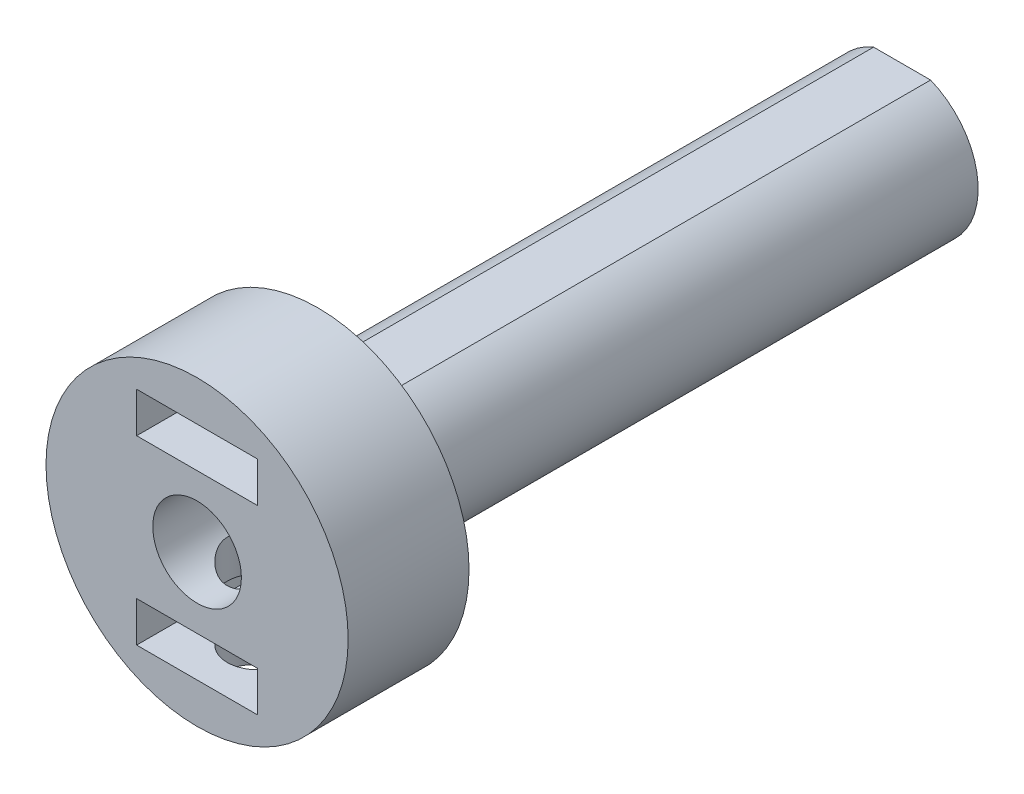
ISO-10303-21;
HEADER;
FILE_DESCRIPTION(('STEP AP214'),'2;1');
FILE_NAME('part.step','',(''),(''),'','','');
FILE_SCHEMA(('AUTOMOTIVE_DESIGN { 1 0 10303 214 1 1 1 1 }'));
ENDSEC;
DATA;
#1=APPLICATION_CONTEXT('core data for automotive mechanical design processes');
#2=APPLICATION_PROTOCOL_DEFINITION('international standard','automotive_design',2000,#1);
#3=PRODUCT_CONTEXT('',#1,'mechanical');
#4=PRODUCT('Part','Part','',(#3));
#5=PRODUCT_RELATED_PRODUCT_CATEGORY('part','',(#4));
#6=PRODUCT_DEFINITION_FORMATION('','',#4);
#7=PRODUCT_DEFINITION_CONTEXT('part definition',#1,'design');
#8=PRODUCT_DEFINITION('design','',#6,#7);
#9=PRODUCT_DEFINITION_SHAPE('','',#8);
#10=(LENGTH_UNIT() NAMED_UNIT(*) SI_UNIT(.MILLI.,.METRE.));
#11=(NAMED_UNIT(*) PLANE_ANGLE_UNIT() SI_UNIT($,.RADIAN.));
#12=(NAMED_UNIT(*) SI_UNIT($,.STERADIAN.) SOLID_ANGLE_UNIT());
#13=UNCERTAINTY_MEASURE_WITH_UNIT(LENGTH_MEASURE(1.E-05),#10,'distance_accuracy_value','');
#14=(GEOMETRIC_REPRESENTATION_CONTEXT(3) GLOBAL_UNCERTAINTY_ASSIGNED_CONTEXT((#13)) GLOBAL_UNIT_ASSIGNED_CONTEXT((#10,
#11,#12)) REPRESENTATION_CONTEXT('',''));
#15=CARTESIAN_POINT('',(0.,0.,0.));
#16=DIRECTION('',(0.,0.,1.));
#17=DIRECTION('',(1.,0.,0.));
#18=AXIS2_PLACEMENT_3D('',#15,#16,#17);
#19=CARTESIAN_POINT('',(0.,0.,35.));
#20=DIRECTION('',(0.,0.,-1.));
#21=DIRECTION('',(-1.,0.,0.));
#22=AXIS2_PLACEMENT_3D('',#19,#20,#21);
#23=CYLINDRICAL_SURFACE('',#22,3.775);
#24=CARTESIAN_POINT('',(0.,0.,29.));
#25=DIRECTION('',(0.,0.,1.));
#26=DIRECTION('',(1.,0.,0.));
#27=AXIS2_PLACEMENT_3D('',#24,#25,#26);
#28=CIRCLE('',#27,3.775);
#29=CARTESIAN_POINT('',(-1.41443451598156,3.5,29.));
#30=VERTEX_POINT('',#29);
#31=CARTESIAN_POINT('',(-1.41443451598156,-3.5,29.));
#32=VERTEX_POINT('',#31);
#33=EDGE_CURVE('E214',#30,#32,#28,.T.);
#34=ORIENTED_EDGE('',*,*,#33,.F.);
#35=DIRECTION('',(0.,0.,-1.));
#36=VECTOR('',#35,1.);
#37=CARTESIAN_POINT('',(-1.41443451598156,3.5,35.));
#38=LINE('',#37,#36);
#39=CARTESIAN_POINT('',(-1.41443451598156,3.5,0.));
#40=VERTEX_POINT('',#39);
#41=EDGE_CURVE('E192',#30,#40,#38,.T.);
#42=ORIENTED_EDGE('',*,*,#41,.T.);
#43=CARTESIAN_POINT('',(0.,0.,0.));
#44=DIRECTION('',(0.,0.,1.));
#45=DIRECTION('',(1.,0.,0.));
#46=AXIS2_PLACEMENT_3D('',#43,#44,#45);
#47=CIRCLE('',#46,3.775);
#48=CARTESIAN_POINT('',(-1.41443451598156,-3.5,0.));
#49=VERTEX_POINT('',#48);
#50=EDGE_CURVE('E210',#40,#49,#47,.T.);
#51=ORIENTED_EDGE('',*,*,#50,.T.);
#52=DIRECTION('',(0.,0.,-1.));
#53=VECTOR('',#52,1.);
#54=CARTESIAN_POINT('',(-1.41443451598156,-3.5,35.));
#55=LINE('',#54,#53);
#56=EDGE_CURVE('E159',#49,#32,#55,.F.);
#57=ORIENTED_EDGE('',*,*,#56,.T.);
#58=EDGE_LOOP('',(#34,#42,#51,#57));
#59=FACE_BOUND('',#58,.T.);
#60=ADVANCED_FACE('F35',(#59),#23,.T.);
#61=CARTESIAN_POINT('',(1.41443451598156,-3.5,0.));
#62=VERTEX_POINT('',#61);
#63=CARTESIAN_POINT('',(1.41443451598156,3.5,0.));
#64=VERTEX_POINT('',#63);
#65=EDGE_CURVE('E205',#62,#64,#47,.T.);
#66=ORIENTED_EDGE('',*,*,#65,.T.);
#67=DIRECTION('',(0.,0.,-1.));
#68=VECTOR('',#67,1.);
#69=CARTESIAN_POINT('',(1.41443451598156,3.5,35.));
#70=LINE('',#69,#68);
#71=CARTESIAN_POINT('',(1.41443451598156,3.5,29.));
#72=VERTEX_POINT('',#71);
#73=EDGE_CURVE('E189',#64,#72,#70,.F.);
#74=ORIENTED_EDGE('',*,*,#73,.T.);
#75=CARTESIAN_POINT('',(1.41443451598156,-3.5,29.));
#76=VERTEX_POINT('',#75);
#77=EDGE_CURVE('E211',#76,#72,#28,.T.);
#78=ORIENTED_EDGE('',*,*,#77,.F.);
#79=DIRECTION('',(0.,0.,-1.));
#80=VECTOR('',#79,1.);
#81=CARTESIAN_POINT('',(1.41443451598156,-3.5,35.));
#82=LINE('',#81,#80);
#83=EDGE_CURVE('E186',#76,#62,#82,.T.);
#84=ORIENTED_EDGE('',*,*,#83,.T.);
#85=EDGE_LOOP('',(#66,#74,#78,#84));
#86=FACE_BOUND('',#85,.T.);
#87=ADVANCED_FACE('F37',(#86),#23,.T.);
#88=CARTESIAN_POINT('',(0.,0.,35.));
#89=DIRECTION('',(0.,0.,1.));
#90=DIRECTION('',(1.,0.,0.));
#91=AXIS2_PLACEMENT_3D('',#88,#89,#90);
#92=PLANE('',#91);
#93=DIRECTION('',(0.,1.,0.));
#94=VECTOR('',#93,1.);
#95=CARTESIAN_POINT('',(3.,5.5,35.));
#96=LINE('',#95,#94);
#97=CARTESIAN_POINT('',(3.,3.5,35.));
#98=VERTEX_POINT('',#97);
#99=CARTESIAN_POINT('',(3.,5.5,35.));
#100=VERTEX_POINT('',#99);
#101=EDGE_CURVE('E53',#98,#100,#96,.T.);
#102=ORIENTED_EDGE('',*,*,#101,.F.);
#103=DIRECTION('',(1.,0.,0.));
#104=VECTOR('',#103,1.);
#105=CARTESIAN_POINT('',(-3.,3.5,35.));
#106=LINE('',#105,#104);
#107=CARTESIAN_POINT('',(-3.,3.5,35.));
#108=VERTEX_POINT('',#107);
#109=EDGE_CURVE('E151',#108,#98,#106,.T.);
#110=ORIENTED_EDGE('',*,*,#109,.F.);
#111=DIRECTION('',(0.,-1.,0.));
#112=VECTOR('',#111,1.);
#113=CARTESIAN_POINT('',(-3.,5.5,35.));
#114=LINE('',#113,#112);
#115=CARTESIAN_POINT('',(-3.,5.5,35.));
#116=VERTEX_POINT('',#115);
#117=EDGE_CURVE('E134',#116,#108,#114,.T.);
#118=ORIENTED_EDGE('',*,*,#117,.F.);
#119=DIRECTION('',(-1.,0.,0.));
#120=VECTOR('',#119,1.);
#121=CARTESIAN_POINT('',(-3.,5.5,35.));
#122=LINE('',#121,#120);
#123=EDGE_CURVE('E144',#100,#116,#122,.T.);
#124=ORIENTED_EDGE('',*,*,#123,.F.);
#125=EDGE_LOOP('',(#102,#110,#118,#124));
#126=FACE_BOUND('',#125,.T.);
#127=DIRECTION('',(0.,-1.,0.));
#128=VECTOR('',#127,1.);
#129=CARTESIAN_POINT('',(-3.,-5.5,35.));
#130=LINE('',#129,#128);
#131=CARTESIAN_POINT('',(-3.,-3.5,35.));
#132=VERTEX_POINT('',#131);
#133=CARTESIAN_POINT('',(-3.,-5.5,35.));
#134=VERTEX_POINT('',#133);
#135=EDGE_CURVE('E61',#132,#134,#130,.T.);
#136=ORIENTED_EDGE('',*,*,#135,.F.);
#137=DIRECTION('',(-1.,0.,0.));
#138=VECTOR('',#137,1.);
#139=CARTESIAN_POINT('',(-3.,-3.5,35.));
#140=LINE('',#139,#138);
#141=CARTESIAN_POINT('',(3.,-3.5,35.));
#142=VERTEX_POINT('',#141);
#143=EDGE_CURVE('E166',#142,#132,#140,.T.);
#144=ORIENTED_EDGE('',*,*,#143,.F.);
#145=DIRECTION('',(0.,1.,0.));
#146=VECTOR('',#145,1.);
#147=CARTESIAN_POINT('',(3.,-5.5,35.));
#148=LINE('',#147,#146);
#149=CARTESIAN_POINT('',(3.,-5.5,35.));
#150=VERTEX_POINT('',#149);
#151=EDGE_CURVE('E172',#150,#142,#148,.T.);
#152=ORIENTED_EDGE('',*,*,#151,.F.);
#153=DIRECTION('',(1.,0.,0.));
#154=VECTOR('',#153,1.);
#155=CARTESIAN_POINT('',(-3.,-5.5,35.));
#156=LINE('',#155,#154);
#157=EDGE_CURVE('E168',#134,#150,#156,.T.);
#158=ORIENTED_EDGE('',*,*,#157,.F.);
#159=EDGE_LOOP('',(#136,#144,#152,#158));
#160=FACE_BOUND('',#159,.T.);
#161=CARTESIAN_POINT('',(0.,0.,35.));
#162=DIRECTION('',(0.,0.,1.));
#163=DIRECTION('',(1.,0.,0.));
#164=AXIS2_PLACEMENT_3D('',#161,#162,#163);
#165=CIRCLE('',#164,2.2);
#166=CARTESIAN_POINT('',(2.2,0.,35.));
#167=VERTEX_POINT('',#166);
#168=EDGE_CURVE('E202',#167,#167,#165,.T.);
#169=ORIENTED_EDGE('',*,*,#168,.F.);
#170=EDGE_LOOP('',(#169));
#171=FACE_BOUND('',#170,.T.);
#172=CARTESIAN_POINT('',(0.,0.,35.));
#173=DIRECTION('',(0.,0.,1.));
#174=DIRECTION('',(1.,0.,0.));
#175=AXIS2_PLACEMENT_3D('',#172,#173,#174);
#176=CIRCLE('',#175,7.5);
#177=CARTESIAN_POINT('',(7.5,0.,35.));
#178=VERTEX_POINT('',#177);
#179=EDGE_CURVE('E195',#178,#178,#176,.T.);
#180=ORIENTED_EDGE('',*,*,#179,.T.);
#181=EDGE_LOOP('',(#180));
#182=FACE_BOUND('',#181,.T.);
#183=ADVANCED_FACE('F148',(#126,#160,#171,#182),#92,.T.);
#184=CARTESIAN_POINT('',(0.,0.,0.));
#185=DIRECTION('',(0.,0.,1.));
#186=DIRECTION('',(1.,0.,0.));
#187=AXIS2_PLACEMENT_3D('',#184,#185,#186);
#188=PLANE('',#187);
#189=ORIENTED_EDGE('',*,*,#50,.F.);
#190=DIRECTION('',(1.,0.,0.));
#191=VECTOR('',#190,1.);
#192=CARTESIAN_POINT('',(-3.,3.5,0.));
#193=LINE('',#192,#191);
#194=EDGE_CURVE('E153',#40,#64,#193,.T.);
#195=ORIENTED_EDGE('',*,*,#194,.T.);
#196=ORIENTED_EDGE('',*,*,#65,.F.);
#197=DIRECTION('',(-1.,0.,0.));
#198=VECTOR('',#197,1.);
#199=CARTESIAN_POINT('',(-3.,-3.5,0.));
#200=LINE('',#199,#198);
#201=EDGE_CURVE('E162',#62,#49,#200,.T.);
#202=ORIENTED_EDGE('',*,*,#201,.T.);
#203=EDGE_LOOP('',(#189,#195,#196,#202));
#204=FACE_BOUND('',#203,.T.);
#205=CARTESIAN_POINT('',(0.,0.,0.));
#206=DIRECTION('',(0.,0.,1.));
#207=DIRECTION('',(1.,0.,0.));
#208=AXIS2_PLACEMENT_3D('',#205,#206,#207);
#209=CIRCLE('',#208,2.2);
#210=CARTESIAN_POINT('',(2.2,0.,0.));
#211=VERTEX_POINT('',#210);
#212=EDGE_CURVE('E199',#211,#211,#209,.T.);
#213=ORIENTED_EDGE('',*,*,#212,.T.);
#214=EDGE_LOOP('',(#213));
#215=FACE_BOUND('',#214,.T.);
#216=ADVANCED_FACE('F296',(#204,#215),#188,.F.);
#217=CARTESIAN_POINT('',(0.,0.,35.));
#218=DIRECTION('',(0.,0.,-1.));
#219=DIRECTION('',(-1.,0.,0.));
#220=AXIS2_PLACEMENT_3D('',#217,#218,#219);
#221=CYLINDRICAL_SURFACE('',#220,2.2);
#222=CARTESIAN_POINT('',(0.,-2.2,33.5));
#223=CARTESIAN_POINT('',(0.0749947236800003,-2.19999876587917,33.4999987617111));
#224=CARTESIAN_POINT('',(0.15000139660477,-2.19613136834137,33.4943431739115));
#225=CARTESIAN_POINT('',(0.297618614641615,-2.18104081694112,33.4720749248396));
#226=CARTESIAN_POINT('',(0.370227583527062,-2.16981292164153,33.4554552007182));
#227=CARTESIAN_POINT('',(0.510678960454555,-2.14110388606965,33.4122971835474));
#228=CARTESIAN_POINT('',(0.578542693049043,-2.12365320456865,33.3858071748667));
#229=CARTESIAN_POINT('',(0.708561327092108,-2.08388327690579,33.3240568886633));
#230=CARTESIAN_POINT('',(0.770715554218414,-2.06156345672123,33.288795577023));
#231=CARTESIAN_POINT('',(0.893630248020961,-2.01151685190503,33.207199416211));
#232=CARTESIAN_POINT('',(0.953804851810724,-1.9834893356327,33.160170438007));
#233=CARTESIAN_POINT('',(1.06595851734569,-1.92554583420865,33.0580621817867));
#234=CARTESIAN_POINT('',(1.11792533396173,-1.89562711898162,33.0029711075305));
#235=CARTESIAN_POINT('',(1.22102587999676,-1.83122019787791,32.8757166926345));
#236=CARTESIAN_POINT('',(1.27058837485202,-1.79679817680349,32.8022375091627));
#237=CARTESIAN_POINT('',(1.35663972827704,-1.7327446393426,32.6460969089472));
#238=CARTESIAN_POINT('',(1.39315102225501,-1.70310495058715,32.5634515727747));
#239=CARTESIAN_POINT('',(1.44253226686971,-1.66127060522603,32.4161658176695));
#240=CARTESIAN_POINT('',(1.45920727089758,-1.64650977162852,32.3535381580968));
#241=CARTESIAN_POINT('',(1.48438184282993,-1.62385459721723,32.2254982668008));
#242=CARTESIAN_POINT('',(1.4928962582051,-1.61594778862538,32.1600913191385));
#243=CARTESIAN_POINT('',(1.50120728205233,-1.60823335448382,32.0279088174044));
#244=CARTESIAN_POINT('',(1.50096198300143,-1.60846466258124,31.9611282123032));
#245=CARTESIAN_POINT('',(1.49166706200119,-1.61708511867639,31.8287018371389));
#246=CARTESIAN_POINT('',(1.48261107737561,-1.62548016215027,31.7630569220892));
#247=CARTESIAN_POINT('',(1.45703685261497,-1.64842759253135,31.6382099407675));
#248=CARTESIAN_POINT('',(1.44094473579542,-1.6626257193026,31.5788511421179));
#249=CARTESIAN_POINT('',(1.40214876841322,-1.69547185796776,31.4636420250226));
#250=CARTESIAN_POINT('',(1.3794397815828,-1.7141233246761,31.4077944732402));
#251=CARTESIAN_POINT('',(1.31533186152764,-1.76416012841628,31.2734655193162));
#252=CARTESIAN_POINT('',(1.27023693131449,-1.79729195535348,31.1973883511484));
#253=CARTESIAN_POINT('',(1.16794328619874,-1.86539520998826,31.0546765023726));
#254=CARTESIAN_POINT('',(1.11072188458761,-1.90036999210653,30.9880599166973));
#255=CARTESIAN_POINT('',(0.984419198169491,-1.9687880960807,30.8647595249156));
#256=CARTESIAN_POINT('',(0.915236676014048,-2.00221497447541,30.8081696197384));
#257=CARTESIAN_POINT('',(0.766347654237348,-2.06377497290833,30.7074241601516));
#258=CARTESIAN_POINT('',(0.686663415612508,-2.09191899358059,30.6632429061034));
#259=CARTESIAN_POINT('',(0.537146765353034,-2.13450495966265,30.5976511402708));
#260=CARTESIAN_POINT('',(0.469046173547685,-2.15060132357203,30.5733639754874));
#261=CARTESIAN_POINT('',(0.328924761012331,-2.17643489148159,30.5347089157273));
#262=CARTESIAN_POINT('',(0.256906622565166,-2.18617638863629,30.5203343237426));
#263=CARTESIAN_POINT('',(0.11066637814047,-2.19844333665874,30.5022691391091));
#264=CARTESIAN_POINT('',(0.0364375831026466,-2.20094402089915,30.4986152150914));
#265=CARTESIAN_POINT('',(-0.111616465790141,-2.19841367489988,30.5023269102472));
#266=CARTESIAN_POINT('',(-0.185441702494,-2.19338232701081,30.509692994169));
#267=CARTESIAN_POINT('',(-0.32644023174148,-2.17674255802001,30.5342975333502));
#268=CARTESIAN_POINT('',(-0.393757191845172,-2.16550537266208,30.5509793000107));
#269=CARTESIAN_POINT('',(-0.524430369312651,-2.13762506973865,30.5929864557801));
#270=CARTESIAN_POINT('',(-0.587785856491799,-2.12098095904274,30.6183134328629));
#271=CARTESIAN_POINT('',(-0.714318580611975,-2.0819406503214,30.6789928291518));
#272=CARTESIAN_POINT('',(-0.777078128415484,-2.05919142172993,30.7149840038628));
#273=CARTESIAN_POINT('',(-0.895935950895949,-2.01033237123317,30.7948304807018));
#274=CARTESIAN_POINT('',(-0.952029169501493,-1.98422002946111,30.8386916893675));
#275=CARTESIAN_POINT('',(-1.06587589663891,-1.92578711915662,30.941353046364));
#276=CARTESIAN_POINT('',(-1.12232665214487,-1.89316034049541,31.0014249799554));
#277=CARTESIAN_POINT('',(-1.22484571380228,-1.82850351902241,31.130211595121));
#278=CARTESIAN_POINT('',(-1.27090915111398,-1.79647376247814,31.1989303062783));
#279=CARTESIAN_POINT('',(-1.34620460549643,-1.7405817419621,31.3344940671726));
#280=CARTESIAN_POINT('',(-1.37687372493794,-1.71620112372699,31.4003228410442));
#281=CARTESIAN_POINT('',(-1.42874491666754,-1.67326845445794,31.5373664129934));
#282=CARTESIAN_POINT('',(-1.44996560369061,-1.65470496444313,31.608570294579));
#283=CARTESIAN_POINT('',(-1.47909084259325,-1.62868341363543,31.7427487329582));
#284=CARTESIAN_POINT('',(-1.48863160782654,-1.61988512297935,31.8051011301944));
#285=CARTESIAN_POINT('',(-1.49974674647588,-1.60960319584728,31.9310905542452));
#286=CARTESIAN_POINT('',(-1.50132846970347,-1.60811281088688,31.9947263413533));
#287=CARTESIAN_POINT('',(-1.49642428201214,-1.61267567051272,32.1213703350556));
#288=CARTESIAN_POINT('',(-1.48994177531449,-1.61872573198886,32.1843787951535));
#289=CARTESIAN_POINT('',(-1.46935087689764,-1.63743565548716,32.3081524526908));
#290=CARTESIAN_POINT('',(-1.45523172603293,-1.65010484222938,32.3689143556455));
#291=CARTESIAN_POINT('',(-1.41448227094035,-1.68528003431741,32.5057998467654));
#292=CARTESIAN_POINT('',(-1.38530409863719,-1.70963152750588,32.5806829400096));
#293=CARTESIAN_POINT('',(-1.31638592265845,-1.76324494888446,32.723491547135));
#294=CARTESIAN_POINT('',(-1.27662995747492,-1.79251427310037,32.7914063296794));
#295=CARTESIAN_POINT('',(-1.18659240167912,-1.85337888173045,32.9210591397196));
#296=CARTESIAN_POINT('',(-1.13611135944255,-1.88500959642087,32.9826416157699));
#297=CARTESIAN_POINT('',(-1.02574877555588,-1.94726919805868,33.0973489507129));
#298=CARTESIAN_POINT('',(-0.965864470644339,-1.97789778731238,33.1504713142282));
#299=CARTESIAN_POINT('',(-0.828822097029066,-2.03946260083001,33.2535274735071));
#300=CARTESIAN_POINT('',(-0.750428942042847,-2.06991400469267,33.3021330349766));
#301=CARTESIAN_POINT('',(-0.583909007487535,-2.12288248773766,33.3847875857927));
#302=CARTESIAN_POINT('',(-0.495802698851472,-2.14541584995098,33.4188664795963));
#303=CARTESIAN_POINT('',(-0.339291613012468,-2.17469098818415,33.4626884874371));
#304=CARTESIAN_POINT('',(-0.272541352575952,-2.18411359252823,33.4766167783012));
#305=CARTESIAN_POINT('',(-0.137196718786638,-2.19676699519378,33.4952706222648));
#306=CARTESIAN_POINT('',(-0.0686033590456432,-2.20000112894388,33.5000011327568));
#307=CARTESIAN_POINT('',(0.,-2.2,33.5));
#308=B_SPLINE_CURVE_WITH_KNOTS('',3,(#222,#223,#224,#225,#226,#227,#228,#229,#230,#231,#232,
#233,#234,#235,#236,#237,#238,#239,#240,#241,#242,#243,#244,#245,#246,#247,#248,#249,#250,#251,
#252,#253,#254,#255,#256,#257,#258,#259,#260,#261,#262,#263,#264,#265,#266,#267,#268,#269,#270,
#271,#272,#273,#274,#275,#276,#277,#278,#279,#280,#281,#282,#283,#284,#285,#286,#287,#288,#289,
#290,#291,#292,#293,#294,#295,#296,#297,#298,#299,#300,#301,#302,#303,#304,#305,#306,#307),
.UNSPECIFIED.,.T.,.F.,(4,2,2,2,2,2,2,2,2,2,2,2,2,2,2,2,2,2,2,2,2,2,2,2,2,2,2,2,2,2,2,2,2,2,2,2,
2,2,2,2,2,2,4),(0.,0.22470493603095,0.44955476343724,0.673318790132407,0.897109210634979,
1.14026209230458,1.38377437331823,1.66772240776541,1.95117995260166,2.14981467883408,
2.34808731679506,2.54730864131074,2.74667394127193,2.93535021297623,3.12417333437865,
3.40602235179241,3.68840339400816,3.97330327749831,4.25760867700085,4.47889005681992,
4.70002179043634,4.9219089993001,5.14380556610624,5.35367602168444,5.5635850475553,
5.79024510932001,6.01707599868182,6.28199476401753,6.54703744759919,6.77603318307729,
7.00457574671598,7.19479566628537,7.38483989417403,7.57480392430947,7.76503629153509,
8.01560717848609,8.26655833356588,8.52266481515964,8.77884669804549,9.06857191674171,
9.3576977953152,9.56336331477427,9.76891795447981),.UNSPECIFIED.);
#309=CARTESIAN_POINT('',(0.,-2.2,33.5));
#310=VERTEX_POINT('',#309);
#311=EDGE_CURVE('E169',#310,#310,#308,.T.);
#312=ORIENTED_EDGE('',*,*,#311,.F.);
#313=EDGE_LOOP('',(#312));
#314=FACE_BOUND('',#313,.T.);
#315=ORIENTED_EDGE('',*,*,#168,.T.);
#316=EDGE_LOOP('',(#315));
#317=FACE_BOUND('',#316,.T.);
#318=ORIENTED_EDGE('',*,*,#212,.F.);
#319=EDGE_LOOP('',(#318));
#320=FACE_BOUND('',#319,.T.);
#321=ADVANCED_FACE('F255',(#314,#317,#320),#221,.F.);
#322=CARTESIAN_POINT('',(0.,0.,29.));
#323=DIRECTION('',(0.,0.,1.));
#324=DIRECTION('',(1.,0.,0.));
#325=AXIS2_PLACEMENT_3D('',#322,#323,#324);
#326=CYLINDRICAL_SURFACE('',#325,7.5);
#327=CARTESIAN_POINT('',(0.,-7.5,33.5));
#328=CARTESIAN_POINT('',(-0.0833653601889502,-7.49999846371307,33.4999969332525));
#329=CARTESIAN_POINT('',(-0.166769490302284,-7.49859577767346,33.4930267355485));
#330=CARTESIAN_POINT('',(-0.33122026153353,-7.49313548434847,33.4653522498271));
#331=CARTESIAN_POINT('',(-0.412264976312035,-7.48907576790279,33.4446370507977));
#332=CARTESIAN_POINT('',(-0.56959545789497,-7.4787547391743,33.3901380895688));
#333=CARTESIAN_POINT('',(-0.645885701899701,-7.47249553615077,33.356366844733));
#334=CARTESIAN_POINT('',(-0.791711983296339,-7.45845597052971,33.2767516287331));
#335=CARTESIAN_POINT('',(-0.861248422613719,-7.4506756985356,33.2309083765892));
#336=CARTESIAN_POINT('',(-0.992540215972298,-7.43433247994955,33.1277922585629));
#337=CARTESIAN_POINT('',(-1.05419092673779,-7.42576118256521,33.0703874669132));
#338=CARTESIAN_POINT('',(-1.16705513491204,-7.40886270678882,32.9460613754124));
#339=CARTESIAN_POINT('',(-1.21826781715564,-7.40053554750636,32.8791393329973));
#340=CARTESIAN_POINT('',(-1.30924763002143,-7.38498662718923,32.7369257104822));
#341=CARTESIAN_POINT('',(-1.3489064082988,-7.37777561047419,32.6615635343055));
#342=CARTESIAN_POINT('',(-1.41495849987046,-7.36539402087627,32.5050772714939));
#343=CARTESIAN_POINT('',(-1.44135312365586,-7.36022324642942,32.4239537549805));
#344=CARTESIAN_POINT('',(-1.47978794982724,-7.35259207878307,32.2593734541381));
#345=CARTESIAN_POINT('',(-1.49201174693817,-7.35009705160781,32.1759611837867));
#346=CARTESIAN_POINT('',(-1.50232819158918,-7.34799562590941,32.0082352679535));
#347=CARTESIAN_POINT('',(-1.50042228407025,-7.34838893201761,31.9239217155198));
#348=CARTESIAN_POINT('',(-1.48268185965273,-7.35198826722277,31.7581298179685));
#349=CARTESIAN_POINT('',(-1.46705781036586,-7.35515179288145,31.676627891559));
#350=CARTESIAN_POINT('',(-1.42265682693458,-7.36386819240002,31.5174258850055));
#351=CARTESIAN_POINT('',(-1.39387926465102,-7.36942118036668,31.4397259866215));
#352=CARTESIAN_POINT('',(-1.32378717551208,-7.38233427750612,31.2897271074446));
#353=CARTESIAN_POINT('',(-1.28238922684817,-7.38970634720557,31.2174681806462));
#354=CARTESIAN_POINT('',(-1.18829036185902,-7.40541928159593,31.0808437250408));
#355=CARTESIAN_POINT('',(-1.13558814653524,-7.41376025757549,31.0164791047233));
#356=CARTESIAN_POINT('',(-1.01924990184088,-7.43065531862193,30.8962558963146));
#357=CARTESIAN_POINT('',(-0.955434241818666,-7.43921053816357,30.8405711482113));
#358=CARTESIAN_POINT('',(-0.819277536093013,-7.45543273071613,30.7406692305482));
#359=CARTESIAN_POINT('',(-0.746936381069082,-7.4630996923346,30.6964522080596));
#360=CARTESIAN_POINT('',(-0.59558908031838,-7.47670035241331,30.620708736161));
#361=CARTESIAN_POINT('',(-0.516572729377949,-7.48263133272408,30.5892021595332));
#362=CARTESIAN_POINT('',(-0.354223464672995,-7.49207113481787,30.5399592889421));
#363=CARTESIAN_POINT('',(-0.270891075108672,-7.49558025000797,30.5222213268896));
#364=CARTESIAN_POINT('',(-0.103769108440723,-7.49974007800301,30.5012653193086));
#365=CARTESIAN_POINT('',(-0.0200104924883622,-7.50043761978705,30.4978093706896));
#366=CARTESIAN_POINT('',(0.146887401289073,-7.49902577895154,30.5048747884133));
#367=CARTESIAN_POINT('',(0.230026713665691,-7.49691655412169,30.5153953690289));
#368=CARTESIAN_POINT('',(0.392558489919812,-7.49015748012026,30.5499175603159));
#369=CARTESIAN_POINT('',(0.471977922509855,-7.4855306460631,30.5737971027469));
#370=CARTESIAN_POINT('',(0.625685441249501,-7.47425328091549,30.6342259739837));
#371=CARTESIAN_POINT('',(0.69997314245631,-7.4676025982134,30.6707762520152));
#372=CARTESIAN_POINT('',(0.842311760529328,-7.45289867299942,30.756023735977));
#373=CARTESIAN_POINT('',(0.910275190128284,-7.44482925655578,30.8048641715584));
#374=CARTESIAN_POINT('',(1.03712702867881,-7.42822102244824,30.9131137868109));
#375=CARTESIAN_POINT('',(1.09601446339615,-7.41968215452582,30.9725240995998));
#376=CARTESIAN_POINT('',(1.20396088616127,-7.40293955335447,31.1013100278367));
#377=CARTESIAN_POINT('',(1.25285655367298,-7.39474290349956,31.170823616332));
#378=CARTESIAN_POINT('',(1.33827813007681,-7.37976287694291,31.317217042035));
#379=CARTESIAN_POINT('',(1.37480453388435,-7.37297944370014,31.3940965843603));
#380=CARTESIAN_POINT('',(1.43422776237294,-7.36165110876574,31.5526523692243));
#381=CARTESIAN_POINT('',(1.45719524968658,-7.3570946230828,31.6343012618155));
#382=CARTESIAN_POINT('',(1.4890629774408,-7.35071155188038,31.8004001802364));
#383=CARTESIAN_POINT('',(1.49796505233767,-7.34888461036667,31.884849839314));
#384=CARTESIAN_POINT('',(1.5013813663012,-7.34818724447069,32.0525132968165));
#385=CARTESIAN_POINT('',(1.49615368210634,-7.34926378783951,32.1357217233905));
#386=CARTESIAN_POINT('',(1.47202845615009,-7.35413360226921,32.3000474748575));
#387=CARTESIAN_POINT('',(1.45313102419395,-7.35792685150754,32.3811648165422));
#388=CARTESIAN_POINT('',(1.40231785274843,-7.36777896328738,32.5388415668608));
#389=CARTESIAN_POINT('',(1.37043376007601,-7.37383231528246,32.6154115407536));
#390=CARTESIAN_POINT('',(1.2945819669024,-7.38752572461256,32.7621555811017));
#391=CARTESIAN_POINT('',(1.25061325316232,-7.39516591498341,32.8323291105877));
#392=CARTESIAN_POINT('',(1.15095887217962,-7.41133440784838,32.9655733582255));
#393=CARTESIAN_POINT('',(1.09508683085277,-7.41987559364549,33.0285031479014));
#394=CARTESIAN_POINT('',(0.973596553519707,-7.43679122807932,33.1441793082938));
#395=CARTESIAN_POINT('',(0.907976080729999,-7.44516563794777,33.1969233354759));
#396=CARTESIAN_POINT('',(0.768026443632368,-7.46090748581957,33.2912519659197));
#397=CARTESIAN_POINT('',(0.693613326644752,-7.46826346828869,33.33271400492));
#398=CARTESIAN_POINT('',(0.5387495414111,-7.481026876275,33.4024791838949));
#399=CARTESIAN_POINT('',(0.45830439129469,-7.48643605707924,33.4307941842987));
#400=CARTESIAN_POINT('',(0.314732233385669,-7.49364558893056,33.4679779220671));
#401=CARTESIAN_POINT('',(0.252422496020677,-7.49601454737677,33.4799647905616));
#402=CARTESIAN_POINT('',(0.1267492878151,-7.49919231209839,33.4959768685376));
#403=CARTESIAN_POINT('',(0.0633858506229283,-7.50000116809732,33.5000023317646));
#404=CARTESIAN_POINT('',(0.,-7.5,33.5));
#405=B_SPLINE_CURVE_WITH_KNOTS('',3,(#327,#328,#329,#330,#331,#332,#333,#334,#335,#336,#337,
#338,#339,#340,#341,#342,#343,#344,#345,#346,#347,#348,#349,#350,#351,#352,#353,#354,#355,#356,
#357,#358,#359,#360,#361,#362,#363,#364,#365,#366,#367,#368,#369,#370,#371,#372,#373,#374,#375,
#376,#377,#378,#379,#380,#381,#382,#383,#384,#385,#386,#387,#388,#389,#390,#391,#392,#393,#394,
#395,#396,#397,#398,#399,#400,#401,#402,#403,#404),.UNSPECIFIED.,.T.,.F.,(4,2,2,2,2,2,2,2,2,2,2,
2,2,2,2,2,2,2,2,2,2,2,2,2,2,2,2,2,2,2,2,2,2,2,2,2,2,2,4),(0.,0.249864195991888,
0.499926976036986,0.749750602875514,0.999559353346297,1.25239900516827,1.50525839512105,
1.76041792508884,2.01555224047796,2.26734277655381,2.51910756421838,2.76707590509417,
3.01505608880595,3.26471235305389,3.51439732124506,3.76857378737026,4.02275351309731,
4.27732912281036,4.53187388547054,4.78216103514398,5.03243411486802,5.28045680926085,
5.52849808824034,5.77957599050039,6.03068082518896,6.28560942868839,6.540527830852,
6.79410571549085,7.04765052495623,7.29659583851553,7.54553915238914,7.79387941879666,
8.04224051372801,8.29482114358716,8.54745981799397,8.80274245013456,9.05779433276279,
9.24778162934842,9.43776287056495),.UNSPECIFIED.);
#406=CARTESIAN_POINT('',(0.,-7.5,33.5));
#407=VERTEX_POINT('',#406);
#408=EDGE_CURVE('E249',#407,#407,#405,.T.);
#409=ORIENTED_EDGE('',*,*,#408,.F.);
#410=EDGE_LOOP('',(#409));
#411=FACE_BOUND('',#410,.T.);
#412=CARTESIAN_POINT('',(0.,0.,29.));
#413=DIRECTION('',(0.,0.,1.));
#414=DIRECTION('',(1.,0.,0.));
#415=AXIS2_PLACEMENT_3D('',#412,#413,#414);
#416=CIRCLE('',#415,7.5);
#417=CARTESIAN_POINT('',(7.5,0.,29.));
#418=VERTEX_POINT('',#417);
#419=EDGE_CURVE('E196',#418,#418,#416,.T.);
#420=ORIENTED_EDGE('',*,*,#419,.T.);
#421=EDGE_LOOP('',(#420));
#422=FACE_BOUND('',#421,.T.);
#423=ORIENTED_EDGE('',*,*,#179,.F.);
#424=EDGE_LOOP('',(#423));
#425=FACE_BOUND('',#424,.T.);
#426=ADVANCED_FACE('F289',(#411,#422,#425),#326,.T.);
#427=CARTESIAN_POINT('',(0.,0.,29.));
#428=DIRECTION('',(0.,0.,1.));
#429=DIRECTION('',(1.,0.,0.));
#430=AXIS2_PLACEMENT_3D('',#427,#428,#429);
#431=PLANE('',#430);
#432=ORIENTED_EDGE('',*,*,#77,.T.);
#433=DIRECTION('',(1.,0.,0.));
#434=VECTOR('',#433,1.);
#435=CARTESIAN_POINT('',(0.,3.5,29.));
#436=LINE('',#435,#434);
#437=CARTESIAN_POINT('',(3.,3.5,29.));
#438=VERTEX_POINT('',#437);
#439=EDGE_CURVE('E11',#72,#438,#436,.T.);
#440=ORIENTED_EDGE('',*,*,#439,.T.);
#441=DIRECTION('',(0.,1.,0.));
#442=VECTOR('',#441,1.);
#443=CARTESIAN_POINT('',(3.,0.,29.));
#444=LINE('',#443,#442);
#445=CARTESIAN_POINT('',(3.,5.5,29.));
#446=VERTEX_POINT('',#445);
#447=EDGE_CURVE('E44',#438,#446,#444,.T.);
#448=ORIENTED_EDGE('',*,*,#447,.T.);
#449=DIRECTION('',(-1.,0.,0.));
#450=VECTOR('',#449,1.);
#451=CARTESIAN_POINT('',(0.,5.5,29.));
#452=LINE('',#451,#450);
#453=CARTESIAN_POINT('',(-3.,5.5,29.));
#454=VERTEX_POINT('',#453);
#455=EDGE_CURVE('E228',#446,#454,#452,.T.);
#456=ORIENTED_EDGE('',*,*,#455,.T.);
#457=DIRECTION('',(0.,-1.,0.));
#458=VECTOR('',#457,1.);
#459=CARTESIAN_POINT('',(-3.,0.,29.));
#460=LINE('',#459,#458);
#461=CARTESIAN_POINT('',(-3.,3.5,29.));
#462=VERTEX_POINT('',#461);
#463=EDGE_CURVE('E137',#454,#462,#460,.T.);
#464=ORIENTED_EDGE('',*,*,#463,.T.);
#465=EDGE_CURVE('E46',#462,#30,#436,.T.);
#466=ORIENTED_EDGE('',*,*,#465,.T.);
#467=ORIENTED_EDGE('',*,*,#33,.T.);
#468=DIRECTION('',(-1.,0.,0.));
#469=VECTOR('',#468,1.);
#470=CARTESIAN_POINT('',(0.,-3.5,29.));
#471=LINE('',#470,#469);
#472=CARTESIAN_POINT('',(-3.,-3.5,29.));
#473=VERTEX_POINT('',#472);
#474=EDGE_CURVE('E225',#32,#473,#471,.T.);
#475=ORIENTED_EDGE('',*,*,#474,.T.);
#476=DIRECTION('',(0.,-1.,0.));
#477=VECTOR('',#476,1.);
#478=CARTESIAN_POINT('',(-3.,0.,29.));
#479=LINE('',#478,#477);
#480=CARTESIAN_POINT('',(-3.,-5.5,29.));
#481=VERTEX_POINT('',#480);
#482=EDGE_CURVE('E224',#473,#481,#479,.T.);
#483=ORIENTED_EDGE('',*,*,#482,.T.);
#484=DIRECTION('',(1.,0.,0.));
#485=VECTOR('',#484,1.);
#486=CARTESIAN_POINT('',(0.,-5.5,29.));
#487=LINE('',#486,#485);
#488=CARTESIAN_POINT('',(3.,-5.5,29.));
#489=VERTEX_POINT('',#488);
#490=EDGE_CURVE('E215',#481,#489,#487,.T.);
#491=ORIENTED_EDGE('',*,*,#490,.T.);
#492=DIRECTION('',(0.,1.,0.));
#493=VECTOR('',#492,1.);
#494=CARTESIAN_POINT('',(3.,0.,29.));
#495=LINE('',#494,#493);
#496=CARTESIAN_POINT('',(3.,-3.5,29.));
#497=VERTEX_POINT('',#496);
#498=EDGE_CURVE('E218',#489,#497,#495,.T.);
#499=ORIENTED_EDGE('',*,*,#498,.T.);
#500=EDGE_CURVE('E221',#497,#76,#471,.T.);
#501=ORIENTED_EDGE('',*,*,#500,.T.);
#502=EDGE_LOOP('',(#432,#440,#448,#456,#464,#466,#467,#475,#483,#491,#499,#501));
#503=FACE_BOUND('',#502,.T.);
#504=ORIENTED_EDGE('',*,*,#419,.F.);
#505=EDGE_LOOP('',(#504));
#506=FACE_BOUND('',#505,.T.);
#507=ADVANCED_FACE('F233',(#503,#506),#431,.F.);
#508=CARTESIAN_POINT('',(-3.,-5.5,0.));
#509=DIRECTION('',(-1.,0.,0.));
#510=DIRECTION('',(0.,0.,1.));
#511=AXIS2_PLACEMENT_3D('',#508,#509,#510);
#512=PLANE('',#511);
#513=DIRECTION('',(0.,0.,1.));
#514=VECTOR('',#513,1.);
#515=CARTESIAN_POINT('',(-3.,-3.5,0.));
#516=LINE('',#515,#514);
#517=EDGE_CURVE('E177',#473,#132,#516,.T.);
#518=ORIENTED_EDGE('',*,*,#517,.T.);
#519=ORIENTED_EDGE('',*,*,#135,.T.);
#520=DIRECTION('',(0.,0.,1.));
#521=VECTOR('',#520,1.);
#522=CARTESIAN_POINT('',(-3.,-5.5,0.));
#523=LINE('',#522,#521);
#524=EDGE_CURVE('E165',#481,#134,#523,.T.);
#525=ORIENTED_EDGE('',*,*,#524,.F.);
#526=ORIENTED_EDGE('',*,*,#482,.F.);
#527=EDGE_LOOP('',(#518,#519,#525,#526));
#528=FACE_BOUND('',#527,.T.);
#529=ADVANCED_FACE('F278',(#528),#512,.F.);
#530=CARTESIAN_POINT('',(-3.,-3.5,0.));
#531=DIRECTION('',(0.,1.,0.));
#532=DIRECTION('',(0.,0.,1.));
#533=AXIS2_PLACEMENT_3D('',#530,#531,#532);
#534=PLANE('',#533);
#535=CARTESIAN_POINT('',(0.,-3.5,32.));
#536=DIRECTION('',(0.,1.,0.));
#537=DIRECTION('',(0.,0.,1.));
#538=AXIS2_PLACEMENT_3D('',#535,#536,#537);
#539=CIRCLE('',#538,1.5);
#540=CARTESIAN_POINT('',(0.,-3.5,33.5));
#541=VERTEX_POINT('',#540);
#542=EDGE_CURVE('E440',#541,#541,#539,.T.);
#543=ORIENTED_EDGE('',*,*,#542,.T.);
#544=EDGE_LOOP('',(#543));
#545=FACE_BOUND('',#544,.T.);
#546=ORIENTED_EDGE('',*,*,#500,.F.);
#547=DIRECTION('',(0.,0.,1.));
#548=VECTOR('',#547,1.);
#549=CARTESIAN_POINT('',(3.,-3.5,0.));
#550=LINE('',#549,#548);
#551=EDGE_CURVE('E179',#497,#142,#550,.T.);
#552=ORIENTED_EDGE('',*,*,#551,.T.);
#553=ORIENTED_EDGE('',*,*,#143,.T.);
#554=ORIENTED_EDGE('',*,*,#517,.F.);
#555=ORIENTED_EDGE('',*,*,#474,.F.);
#556=ORIENTED_EDGE('',*,*,#56,.F.);
#557=ORIENTED_EDGE('',*,*,#201,.F.);
#558=ORIENTED_EDGE('',*,*,#83,.F.);
#559=EDGE_LOOP('',(#546,#552,#553,#554,#555,#556,#557,#558));
#560=FACE_BOUND('',#559,.T.);
#561=ADVANCED_FACE('F274',(#545,#560),#534,.F.);
#562=CARTESIAN_POINT('',(3.,-5.5,0.));
#563=DIRECTION('',(1.,0.,0.));
#564=DIRECTION('',(0.,0.,-1.));
#565=AXIS2_PLACEMENT_3D('',#562,#563,#564);
#566=PLANE('',#565);
#567=DIRECTION('',(0.,0.,1.));
#568=VECTOR('',#567,1.);
#569=CARTESIAN_POINT('',(3.,-5.5,0.));
#570=LINE('',#569,#568);
#571=EDGE_CURVE('E181',#489,#150,#570,.T.);
#572=ORIENTED_EDGE('',*,*,#571,.T.);
#573=ORIENTED_EDGE('',*,*,#151,.T.);
#574=ORIENTED_EDGE('',*,*,#551,.F.);
#575=ORIENTED_EDGE('',*,*,#498,.F.);
#576=EDGE_LOOP('',(#572,#573,#574,#575));
#577=FACE_BOUND('',#576,.T.);
#578=ADVANCED_FACE('F277',(#577),#566,.F.);
#579=CARTESIAN_POINT('',(-3.,-5.5,0.));
#580=DIRECTION('',(0.,-1.,0.));
#581=DIRECTION('',(0.,0.,-1.));
#582=AXIS2_PLACEMENT_3D('',#579,#580,#581);
#583=PLANE('',#582);
#584=CARTESIAN_POINT('',(0.,-5.5,32.));
#585=DIRECTION('',(0.,-1.,0.));
#586=DIRECTION('',(0.,0.,-1.));
#587=AXIS2_PLACEMENT_3D('',#584,#585,#586);
#588=CIRCLE('',#587,1.5);
#589=CARTESIAN_POINT('',(0.,-5.5,30.5));
#590=VERTEX_POINT('',#589);
#591=EDGE_CURVE('E39',#590,#590,#588,.T.);
#592=ORIENTED_EDGE('',*,*,#591,.T.);
#593=EDGE_LOOP('',(#592));
#594=FACE_BOUND('',#593,.T.);
#595=ORIENTED_EDGE('',*,*,#524,.T.);
#596=ORIENTED_EDGE('',*,*,#157,.T.);
#597=ORIENTED_EDGE('',*,*,#571,.F.);
#598=ORIENTED_EDGE('',*,*,#490,.F.);
#599=EDGE_LOOP('',(#595,#596,#597,#598));
#600=FACE_BOUND('',#599,.T.);
#601=ADVANCED_FACE('F273',(#594,#600),#583,.F.);
#602=CARTESIAN_POINT('',(3.,5.5,0.));
#603=DIRECTION('',(1.,0.,0.));
#604=DIRECTION('',(0.,0.,-1.));
#605=AXIS2_PLACEMENT_3D('',#602,#603,#604);
#606=PLANE('',#605);
#607=DIRECTION('',(0.,0.,1.));
#608=VECTOR('',#607,1.);
#609=CARTESIAN_POINT('',(3.,3.5,0.));
#610=LINE('',#609,#608);
#611=EDGE_CURVE('E157',#438,#98,#610,.T.);
#612=ORIENTED_EDGE('',*,*,#611,.T.);
#613=ORIENTED_EDGE('',*,*,#101,.T.);
#614=DIRECTION('',(0.,0.,1.));
#615=VECTOR('',#614,1.);
#616=CARTESIAN_POINT('',(3.,5.5,0.));
#617=LINE('',#616,#615);
#618=EDGE_CURVE('E141',#446,#100,#617,.T.);
#619=ORIENTED_EDGE('',*,*,#618,.F.);
#620=ORIENTED_EDGE('',*,*,#447,.F.);
#621=EDGE_LOOP('',(#612,#613,#619,#620));
#622=FACE_BOUND('',#621,.T.);
#623=ADVANCED_FACE('F236',(#622),#606,.F.);
#624=CARTESIAN_POINT('',(-3.,3.5,0.));
#625=DIRECTION('',(0.,-1.,0.));
#626=DIRECTION('',(0.,0.,-1.));
#627=AXIS2_PLACEMENT_3D('',#624,#625,#626);
#628=PLANE('',#627);
#629=ORIENTED_EDGE('',*,*,#465,.F.);
#630=DIRECTION('',(0.,0.,1.));
#631=VECTOR('',#630,1.);
#632=CARTESIAN_POINT('',(-3.,3.5,0.));
#633=LINE('',#632,#631);
#634=EDGE_CURVE('E140',#462,#108,#633,.T.);
#635=ORIENTED_EDGE('',*,*,#634,.T.);
#636=ORIENTED_EDGE('',*,*,#109,.T.);
#637=ORIENTED_EDGE('',*,*,#611,.F.);
#638=ORIENTED_EDGE('',*,*,#439,.F.);
#639=ORIENTED_EDGE('',*,*,#73,.F.);
#640=ORIENTED_EDGE('',*,*,#194,.F.);
#641=ORIENTED_EDGE('',*,*,#41,.F.);
#642=EDGE_LOOP('',(#629,#635,#636,#637,#638,#639,#640,#641));
#643=FACE_BOUND('',#642,.T.);
#644=ADVANCED_FACE('F238',(#643),#628,.F.);
#645=CARTESIAN_POINT('',(-3.,5.5,0.));
#646=DIRECTION('',(-1.,0.,0.));
#647=DIRECTION('',(0.,0.,1.));
#648=AXIS2_PLACEMENT_3D('',#645,#646,#647);
#649=PLANE('',#648);
#650=DIRECTION('',(0.,0.,1.));
#651=VECTOR('',#650,1.);
#652=CARTESIAN_POINT('',(-3.,5.5,0.));
#653=LINE('',#652,#651);
#654=EDGE_CURVE('E129',#454,#116,#653,.T.);
#655=ORIENTED_EDGE('',*,*,#654,.T.);
#656=ORIENTED_EDGE('',*,*,#117,.T.);
#657=ORIENTED_EDGE('',*,*,#634,.F.);
#658=ORIENTED_EDGE('',*,*,#463,.F.);
#659=EDGE_LOOP('',(#655,#656,#657,#658));
#660=FACE_BOUND('',#659,.T.);
#661=ADVANCED_FACE('F131',(#660),#649,.F.);
#662=CARTESIAN_POINT('',(-3.,5.5,0.));
#663=DIRECTION('',(0.,1.,0.));
#664=DIRECTION('',(0.,0.,1.));
#665=AXIS2_PLACEMENT_3D('',#662,#663,#664);
#666=PLANE('',#665);
#667=ORIENTED_EDGE('',*,*,#618,.T.);
#668=ORIENTED_EDGE('',*,*,#123,.T.);
#669=ORIENTED_EDGE('',*,*,#654,.F.);
#670=ORIENTED_EDGE('',*,*,#455,.F.);
#671=EDGE_LOOP('',(#667,#668,#669,#670));
#672=FACE_BOUND('',#671,.T.);
#673=ADVANCED_FACE('F145',(#672),#666,.F.);
#674=CARTESIAN_POINT('',(0.,-7.5,32.));
#675=DIRECTION('',(0.,1.,0.));
#676=DIRECTION('',(0.,0.,1.));
#677=AXIS2_PLACEMENT_3D('',#674,#675,#676);
#678=CYLINDRICAL_SURFACE('',#677,1.5);
#679=ORIENTED_EDGE('',*,*,#408,.T.);
#680=EDGE_LOOP('',(#679));
#681=FACE_BOUND('',#680,.T.);
#682=ORIENTED_EDGE('',*,*,#591,.F.);
#683=EDGE_LOOP('',(#682));
#684=FACE_BOUND('',#683,.T.);
#685=ADVANCED_FACE('F262',(#681,#684),#678,.F.);
#686=ORIENTED_EDGE('',*,*,#311,.T.);
#687=EDGE_LOOP('',(#686));
#688=FACE_BOUND('',#687,.T.);
#689=ORIENTED_EDGE('',*,*,#542,.F.);
#690=EDGE_LOOP('',(#689));
#691=FACE_BOUND('',#690,.T.);
#692=ADVANCED_FACE('F258',(#688,#691),#678,.F.);
#693=CLOSED_SHELL('',(#60,#87,#183,#216,#321,#426,#507,#529,#561,#578,#601,#623,#644,#661,#673,
#685,#692));
#694=MANIFOLD_SOLID_BREP('B2',#693);
#695=ADVANCED_BREP_SHAPE_REPRESENTATION('',(#18,#694),#14);
#696=SHAPE_DEFINITION_REPRESENTATION(#9,#695);
ENDSEC;
END-ISO-10303-21;
